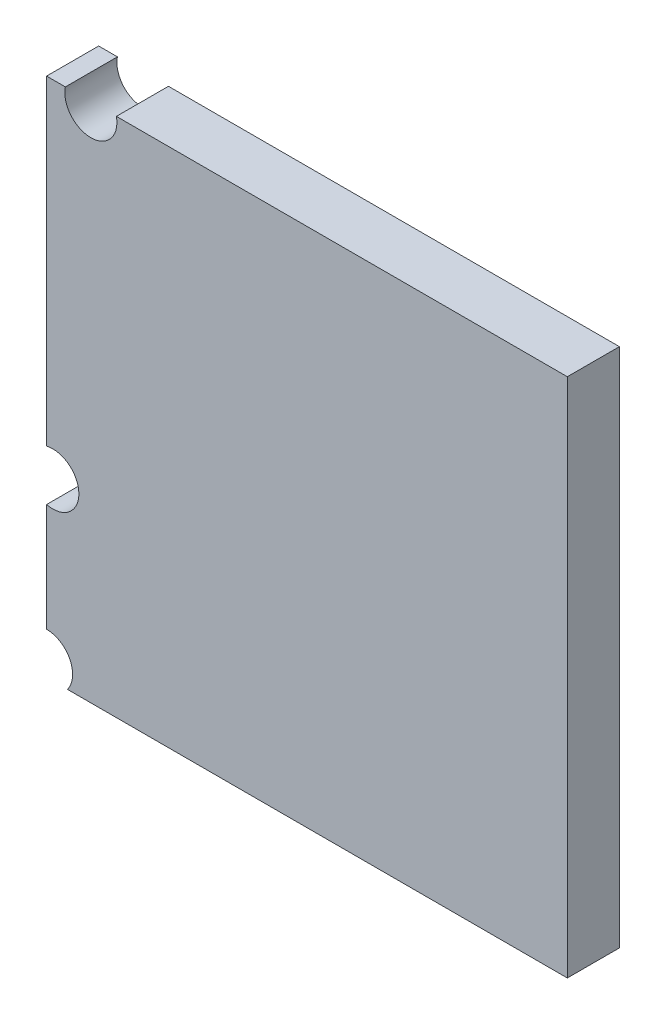
ISO-10303-21;
HEADER;
FILE_DESCRIPTION(('STEP AP214'),'2;1');
FILE_NAME('part.step','',(''),(''),'','','');
FILE_SCHEMA(('AUTOMOTIVE_DESIGN { 1 0 10303 214 1 1 1 1 }'));
ENDSEC;
DATA;
#1=APPLICATION_CONTEXT('core data for automotive mechanical design processes');
#2=APPLICATION_PROTOCOL_DEFINITION('international standard','automotive_design',2000,#1);
#3=PRODUCT_CONTEXT('',#1,'mechanical');
#4=PRODUCT('Part','Part','',(#3));
#5=PRODUCT_RELATED_PRODUCT_CATEGORY('part','',(#4));
#6=PRODUCT_DEFINITION_FORMATION('','',#4);
#7=PRODUCT_DEFINITION_CONTEXT('part definition',#1,'design');
#8=PRODUCT_DEFINITION('design','',#6,#7);
#9=PRODUCT_DEFINITION_SHAPE('','',#8);
#10=(LENGTH_UNIT() NAMED_UNIT(*) SI_UNIT(.MILLI.,.METRE.));
#11=(NAMED_UNIT(*) PLANE_ANGLE_UNIT() SI_UNIT($,.RADIAN.));
#12=(NAMED_UNIT(*) SI_UNIT($,.STERADIAN.) SOLID_ANGLE_UNIT());
#13=UNCERTAINTY_MEASURE_WITH_UNIT(LENGTH_MEASURE(1.E-05),#10,'distance_accuracy_value','');
#14=(GEOMETRIC_REPRESENTATION_CONTEXT(3) GLOBAL_UNCERTAINTY_ASSIGNED_CONTEXT((#13)) GLOBAL_UNIT_ASSIGNED_CONTEXT((#10,
#11,#12)) REPRESENTATION_CONTEXT('',''));
#15=CARTESIAN_POINT('',(0.,0.,0.));
#16=DIRECTION('',(0.,0.,1.));
#17=DIRECTION('',(1.,0.,0.));
#18=AXIS2_PLACEMENT_3D('',#15,#16,#17);
#19=CARTESIAN_POINT('',(0.,100.,10.));
#20=DIRECTION('',(0.,-1.,0.));
#21=DIRECTION('',(0.,0.,-1.));
#22=AXIS2_PLACEMENT_3D('',#19,#20,#21);
#23=PLANE('',#22);
#24=DIRECTION('',(0.,0.,-1.));
#25=VECTOR('',#24,1.);
#26=CARTESIAN_POINT('',(3.60102051443364,100.,10.));
#27=LINE('',#26,#25);
#28=CARTESIAN_POINT('',(3.60102051443364,100.,0.));
#29=VERTEX_POINT('',#28);
#30=CARTESIAN_POINT('',(3.60102051443364,100.,10.));
#31=VERTEX_POINT('',#30);
#32=EDGE_CURVE('E111',#29,#31,#27,.F.);
#33=ORIENTED_EDGE('',*,*,#32,.F.);
#34=DIRECTION('',(-1.,0.,0.));
#35=VECTOR('',#34,1.);
#36=CARTESIAN_POINT('',(0.,100.,0.));
#37=LINE('',#36,#35);
#38=CARTESIAN_POINT('',(0.,100.,0.));
#39=VERTEX_POINT('',#38);
#40=EDGE_CURVE('E154',#29,#39,#37,.T.);
#41=ORIENTED_EDGE('',*,*,#40,.T.);
#42=DIRECTION('',(0.,0.,-1.));
#43=VECTOR('',#42,1.);
#44=CARTESIAN_POINT('',(0.,100.,10.));
#45=LINE('',#44,#43);
#46=CARTESIAN_POINT('',(0.,100.,10.));
#47=VERTEX_POINT('',#46);
#48=EDGE_CURVE('E132',#47,#39,#45,.T.);
#49=ORIENTED_EDGE('',*,*,#48,.F.);
#50=DIRECTION('',(-1.,0.,0.));
#51=VECTOR('',#50,1.);
#52=CARTESIAN_POINT('',(0.,100.,10.));
#53=LINE('',#52,#51);
#54=EDGE_CURVE('E133',#31,#47,#53,.T.);
#55=ORIENTED_EDGE('',*,*,#54,.F.);
#56=EDGE_LOOP('',(#33,#41,#49,#55));
#57=FACE_BOUND('',#56,.T.);
#58=ADVANCED_FACE('F39',(#57),#23,.F.);
#59=DIRECTION('',(0.,0.,-1.));
#60=VECTOR('',#59,1.);
#61=CARTESIAN_POINT('',(13.3989794855664,100.,10.));
#62=LINE('',#61,#60);
#63=CARTESIAN_POINT('',(13.3989794855664,100.,10.));
#64=VERTEX_POINT('',#63);
#65=CARTESIAN_POINT('',(13.3989794855664,100.,0.));
#66=VERTEX_POINT('',#65);
#67=EDGE_CURVE('E55',#64,#66,#62,.T.);
#68=ORIENTED_EDGE('',*,*,#67,.F.);
#69=CARTESIAN_POINT('',(100.,100.,10.));
#70=VERTEX_POINT('',#69);
#71=EDGE_CURVE('E122',#70,#64,#53,.T.);
#72=ORIENTED_EDGE('',*,*,#71,.F.);
#73=DIRECTION('',(0.,0.,-1.));
#74=VECTOR('',#73,1.);
#75=CARTESIAN_POINT('',(100.,100.,10.));
#76=LINE('',#75,#74);
#77=CARTESIAN_POINT('',(100.,100.,0.));
#78=VERTEX_POINT('',#77);
#79=EDGE_CURVE('E138',#70,#78,#76,.T.);
#80=ORIENTED_EDGE('',*,*,#79,.T.);
#81=EDGE_CURVE('E124',#78,#66,#37,.T.);
#82=ORIENTED_EDGE('',*,*,#81,.T.);
#83=EDGE_LOOP('',(#68,#72,#80,#82));
#84=FACE_BOUND('',#83,.T.);
#85=ADVANCED_FACE('F120',(#84),#23,.F.);
#86=CARTESIAN_POINT('',(0.,0.,10.));
#87=DIRECTION('',(1.,0.,0.));
#88=DIRECTION('',(0.,0.,-1.));
#89=AXIS2_PLACEMENT_3D('',#86,#87,#88);
#90=PLANE('',#89);
#91=DIRECTION('',(0.,0.,-1.));
#92=VECTOR('',#91,1.);
#93=CARTESIAN_POINT('',(0.,28.7461355601954,10.));
#94=LINE('',#93,#92);
#95=CARTESIAN_POINT('',(0.,28.7461355601954,0.));
#96=VERTEX_POINT('',#95);
#97=CARTESIAN_POINT('',(0.,28.7461355601954,10.));
#98=VERTEX_POINT('',#97);
#99=EDGE_CURVE('E195',#96,#98,#94,.F.);
#100=ORIENTED_EDGE('',*,*,#99,.F.);
#101=DIRECTION('',(0.,-1.,0.));
#102=VECTOR('',#101,1.);
#103=CARTESIAN_POINT('',(0.,0.,0.));
#104=LINE('',#103,#102);
#105=CARTESIAN_POINT('',(0.,8.,0.));
#106=VERTEX_POINT('',#105);
#107=EDGE_CURVE('E148',#96,#106,#104,.T.);
#108=ORIENTED_EDGE('',*,*,#107,.T.);
#109=DIRECTION('',(0.,0.,-1.));
#110=VECTOR('',#109,1.);
#111=CARTESIAN_POINT('',(0.,8.,10.));
#112=LINE('',#111,#110);
#113=CARTESIAN_POINT('',(0.,8.,10.));
#114=VERTEX_POINT('',#113);
#115=EDGE_CURVE('E185',#114,#106,#112,.T.);
#116=ORIENTED_EDGE('',*,*,#115,.F.);
#117=DIRECTION('',(0.,-1.,0.));
#118=VECTOR('',#117,1.);
#119=CARTESIAN_POINT('',(0.,0.,10.));
#120=LINE('',#119,#118);
#121=EDGE_CURVE('E156',#98,#114,#120,.T.);
#122=ORIENTED_EDGE('',*,*,#121,.F.);
#123=EDGE_LOOP('',(#100,#108,#116,#122));
#124=FACE_BOUND('',#123,.T.);
#125=ADVANCED_FACE('F41',(#124),#90,.F.);
#126=DIRECTION('',(0.,0.,-1.));
#127=VECTOR('',#126,1.);
#128=CARTESIAN_POINT('',(0.,38.4538644398046,10.));
#129=LINE('',#128,#127);
#130=CARTESIAN_POINT('',(0.,38.4538644398046,10.));
#131=VERTEX_POINT('',#130);
#132=CARTESIAN_POINT('',(0.,38.4538644398046,0.));
#133=VERTEX_POINT('',#132);
#134=EDGE_CURVE('E62',#131,#133,#129,.T.);
#135=ORIENTED_EDGE('',*,*,#134,.F.);
#136=EDGE_CURVE('E179',#47,#131,#120,.T.);
#137=ORIENTED_EDGE('',*,*,#136,.F.);
#138=ORIENTED_EDGE('',*,*,#48,.T.);
#139=EDGE_CURVE('E143',#39,#133,#104,.T.);
#140=ORIENTED_EDGE('',*,*,#139,.T.);
#141=EDGE_LOOP('',(#135,#137,#138,#140));
#142=FACE_BOUND('',#141,.T.);
#143=ADVANCED_FACE('F175',(#142),#90,.F.);
#144=CARTESIAN_POINT('',(0.,0.,10.));
#145=DIRECTION('',(0.,1.,0.));
#146=DIRECTION('',(0.,0.,1.));
#147=AXIS2_PLACEMENT_3D('',#144,#145,#146);
#148=PLANE('',#147);
#149=DIRECTION('',(0.,0.,-1.));
#150=VECTOR('',#149,1.);
#151=CARTESIAN_POINT('',(4.,0.,10.));
#152=LINE('',#151,#150);
#153=CARTESIAN_POINT('',(4.,0.,0.));
#154=VERTEX_POINT('',#153);
#155=CARTESIAN_POINT('',(4.,0.,10.));
#156=VERTEX_POINT('',#155);
#157=EDGE_CURVE('E188',#154,#156,#152,.F.);
#158=ORIENTED_EDGE('',*,*,#157,.F.);
#159=DIRECTION('',(1.,0.,0.));
#160=VECTOR('',#159,1.);
#161=CARTESIAN_POINT('',(0.,0.,0.));
#162=LINE('',#161,#160);
#163=CARTESIAN_POINT('',(100.,0.,0.));
#164=VERTEX_POINT('',#163);
#165=EDGE_CURVE('E147',#154,#164,#162,.T.);
#166=ORIENTED_EDGE('',*,*,#165,.T.);
#167=DIRECTION('',(0.,0.,-1.));
#168=VECTOR('',#167,1.);
#169=CARTESIAN_POINT('',(100.,0.,10.));
#170=LINE('',#169,#168);
#171=CARTESIAN_POINT('',(100.,0.,10.));
#172=VERTEX_POINT('',#171);
#173=EDGE_CURVE('E160',#172,#164,#170,.T.);
#174=ORIENTED_EDGE('',*,*,#173,.F.);
#175=DIRECTION('',(1.,0.,0.));
#176=VECTOR('',#175,1.);
#177=CARTESIAN_POINT('',(0.,0.,10.));
#178=LINE('',#177,#176);
#179=EDGE_CURVE('E207',#156,#172,#178,.T.);
#180=ORIENTED_EDGE('',*,*,#179,.F.);
#181=EDGE_LOOP('',(#158,#166,#174,#180));
#182=FACE_BOUND('',#181,.T.);
#183=ADVANCED_FACE('F215',(#182),#148,.F.);
#184=CARTESIAN_POINT('',(100.,0.,10.));
#185=DIRECTION('',(-1.,0.,0.));
#186=DIRECTION('',(0.,0.,1.));
#187=AXIS2_PLACEMENT_3D('',#184,#185,#186);
#188=PLANE('',#187);
#189=DIRECTION('',(0.,1.,0.));
#190=VECTOR('',#189,1.);
#191=CARTESIAN_POINT('',(100.,0.,0.));
#192=LINE('',#191,#190);
#193=EDGE_CURVE('E151',#164,#78,#192,.T.);
#194=ORIENTED_EDGE('',*,*,#193,.T.);
#195=ORIENTED_EDGE('',*,*,#79,.F.);
#196=DIRECTION('',(0.,1.,0.));
#197=VECTOR('',#196,1.);
#198=CARTESIAN_POINT('',(100.,0.,10.));
#199=LINE('',#198,#197);
#200=EDGE_CURVE('E129',#172,#70,#199,.T.);
#201=ORIENTED_EDGE('',*,*,#200,.F.);
#202=ORIENTED_EDGE('',*,*,#173,.T.);
#203=EDGE_LOOP('',(#194,#195,#201,#202));
#204=FACE_BOUND('',#203,.T.);
#205=ADVANCED_FACE('F219',(#204),#188,.F.);
#206=CARTESIAN_POINT('',(0.,0.,10.));
#207=DIRECTION('',(0.,0.,-1.));
#208=DIRECTION('',(-1.,0.,0.));
#209=AXIS2_PLACEMENT_3D('',#206,#207,#208);
#210=PLANE('',#209);
#211=CARTESIAN_POINT('',(8.5,99.,10.));
#212=DIRECTION('',(0.,0.,1.));
#213=DIRECTION('',(1.,0.,0.));
#214=AXIS2_PLACEMENT_3D('',#211,#212,#213);
#215=CIRCLE('',#214,5.);
#216=EDGE_CURVE('E108',#31,#64,#215,.T.);
#217=ORIENTED_EDGE('',*,*,#216,.F.);
#218=ORIENTED_EDGE('',*,*,#54,.T.);
#219=ORIENTED_EDGE('',*,*,#136,.T.);
#220=CARTESIAN_POINT('',(1.2,33.6,10.));
#221=DIRECTION('',(0.,0.,1.));
#222=DIRECTION('',(1.,0.,0.));
#223=AXIS2_PLACEMENT_3D('',#220,#221,#222);
#224=CIRCLE('',#223,5.);
#225=EDGE_CURVE('E200',#98,#131,#224,.T.);
#226=ORIENTED_EDGE('',*,*,#225,.F.);
#227=ORIENTED_EDGE('',*,*,#121,.T.);
#228=CARTESIAN_POINT('',(0.,3.,10.));
#229=DIRECTION('',(0.,0.,1.));
#230=DIRECTION('',(1.,0.,0.));
#231=AXIS2_PLACEMENT_3D('',#228,#229,#230);
#232=CIRCLE('',#231,5.);
#233=EDGE_CURVE('E191',#156,#114,#232,.T.);
#234=ORIENTED_EDGE('',*,*,#233,.F.);
#235=ORIENTED_EDGE('',*,*,#179,.T.);
#236=ORIENTED_EDGE('',*,*,#200,.T.);
#237=ORIENTED_EDGE('',*,*,#71,.T.);
#238=EDGE_LOOP('',(#217,#218,#219,#226,#227,#234,#235,#236,#237));
#239=FACE_BOUND('',#238,.T.);
#240=ADVANCED_FACE('F127',(#239),#210,.F.);
#241=CARTESIAN_POINT('',(0.,0.,0.));
#242=DIRECTION('',(0.,0.,-1.));
#243=DIRECTION('',(-1.,0.,0.));
#244=AXIS2_PLACEMENT_3D('',#241,#242,#243);
#245=PLANE('',#244);
#246=ORIENTED_EDGE('',*,*,#40,.F.);
#247=CARTESIAN_POINT('',(8.5,99.,0.));
#248=DIRECTION('',(0.,0.,-1.));
#249=DIRECTION('',(-1.,0.,0.));
#250=AXIS2_PLACEMENT_3D('',#247,#248,#249);
#251=CIRCLE('',#250,5.);
#252=EDGE_CURVE('E11',#29,#66,#251,.F.);
#253=ORIENTED_EDGE('',*,*,#252,.T.);
#254=ORIENTED_EDGE('',*,*,#81,.F.);
#255=ORIENTED_EDGE('',*,*,#193,.F.);
#256=ORIENTED_EDGE('',*,*,#165,.F.);
#257=CARTESIAN_POINT('',(0.,3.,0.));
#258=DIRECTION('',(0.,0.,-1.));
#259=DIRECTION('',(-1.,0.,0.));
#260=AXIS2_PLACEMENT_3D('',#257,#258,#259);
#261=CIRCLE('',#260,5.);
#262=EDGE_CURVE('E164',#154,#106,#261,.F.);
#263=ORIENTED_EDGE('',*,*,#262,.T.);
#264=ORIENTED_EDGE('',*,*,#107,.F.);
#265=CARTESIAN_POINT('',(1.2,33.6,0.));
#266=DIRECTION('',(0.,0.,-1.));
#267=DIRECTION('',(-1.,0.,0.));
#268=AXIS2_PLACEMENT_3D('',#265,#266,#267);
#269=CIRCLE('',#268,5.);
#270=EDGE_CURVE('E48',#96,#133,#269,.F.);
#271=ORIENTED_EDGE('',*,*,#270,.T.);
#272=ORIENTED_EDGE('',*,*,#139,.F.);
#273=EDGE_LOOP('',(#246,#253,#254,#255,#256,#263,#264,#271,#272));
#274=FACE_BOUND('',#273,.T.);
#275=ADVANCED_FACE('F172',(#274),#245,.T.);
#276=CARTESIAN_POINT('',(0.,3.,10.));
#277=DIRECTION('',(0.,0.,-1.));
#278=DIRECTION('',(-1.,0.,0.));
#279=AXIS2_PLACEMENT_3D('',#276,#277,#278);
#280=CYLINDRICAL_SURFACE('',#279,5.);
#281=ORIENTED_EDGE('',*,*,#115,.T.);
#282=ORIENTED_EDGE('',*,*,#262,.F.);
#283=ORIENTED_EDGE('',*,*,#157,.T.);
#284=ORIENTED_EDGE('',*,*,#233,.T.);
#285=EDGE_LOOP('',(#281,#282,#283,#284));
#286=FACE_BOUND('',#285,.T.);
#287=ADVANCED_FACE('F221',(#286),#280,.F.);
#288=CARTESIAN_POINT('',(1.2,33.6,10.));
#289=DIRECTION('',(0.,0.,-1.));
#290=DIRECTION('',(-1.,0.,0.));
#291=AXIS2_PLACEMENT_3D('',#288,#289,#290);
#292=CYLINDRICAL_SURFACE('',#291,5.);
#293=ORIENTED_EDGE('',*,*,#99,.T.);
#294=ORIENTED_EDGE('',*,*,#225,.T.);
#295=ORIENTED_EDGE('',*,*,#134,.T.);
#296=ORIENTED_EDGE('',*,*,#270,.F.);
#297=EDGE_LOOP('',(#293,#294,#295,#296));
#298=FACE_BOUND('',#297,.T.);
#299=ADVANCED_FACE('F226',(#298),#292,.F.);
#300=CARTESIAN_POINT('',(8.5,99.,10.));
#301=DIRECTION('',(0.,0.,-1.));
#302=DIRECTION('',(-1.,0.,0.));
#303=AXIS2_PLACEMENT_3D('',#300,#301,#302);
#304=CYLINDRICAL_SURFACE('',#303,5.);
#305=ORIENTED_EDGE('',*,*,#32,.T.);
#306=ORIENTED_EDGE('',*,*,#216,.T.);
#307=ORIENTED_EDGE('',*,*,#67,.T.);
#308=ORIENTED_EDGE('',*,*,#252,.F.);
#309=EDGE_LOOP('',(#305,#306,#307,#308));
#310=FACE_BOUND('',#309,.T.);
#311=ADVANCED_FACE('F109',(#310),#304,.F.);
#312=CLOSED_SHELL('',(#58,#85,#125,#143,#183,#205,#240,#275,#287,#299,#311));
#313=MANIFOLD_SOLID_BREP('B2',#312);
#314=ADVANCED_BREP_SHAPE_REPRESENTATION('',(#18,#313),#14);
#315=SHAPE_DEFINITION_REPRESENTATION(#9,#314);
ENDSEC;
END-ISO-10303-21;
